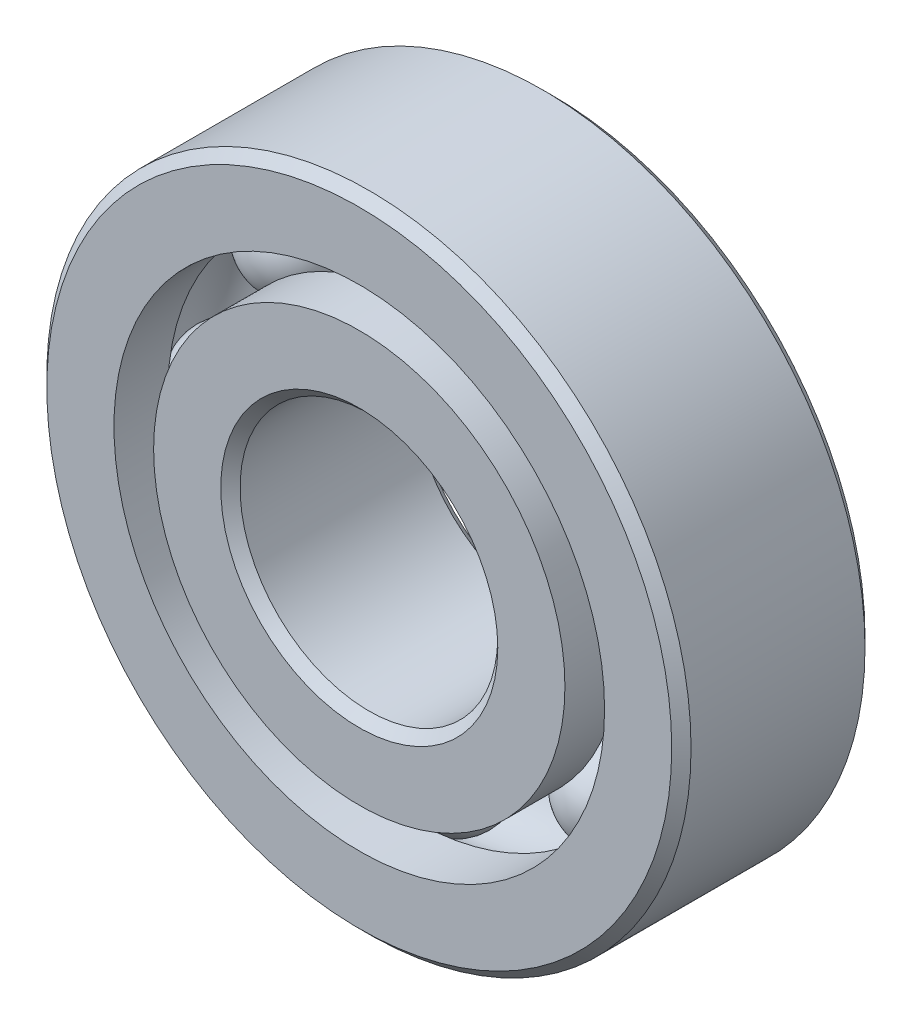
ISO-10303-21;
HEADER;
FILE_DESCRIPTION(('STEP AP214'),'2;1');
FILE_NAME('part.step','',(''),(''),'','','');
FILE_SCHEMA(('AUTOMOTIVE_DESIGN { 1 0 10303 214 1 1 1 1 }'));
ENDSEC;
DATA;
#1=APPLICATION_CONTEXT('core data for automotive mechanical design processes');
#2=APPLICATION_PROTOCOL_DEFINITION('international standard','automotive_design',2000,#1);
#3=PRODUCT_CONTEXT('',#1,'mechanical');
#4=PRODUCT('Part','Part','',(#3));
#5=PRODUCT_RELATED_PRODUCT_CATEGORY('part','',(#4));
#6=PRODUCT_DEFINITION_FORMATION('','',#4);
#7=PRODUCT_DEFINITION_CONTEXT('part definition',#1,'design');
#8=PRODUCT_DEFINITION('design','',#6,#7);
#9=PRODUCT_DEFINITION_SHAPE('','',#8);
#10=(LENGTH_UNIT() NAMED_UNIT(*) SI_UNIT(.MILLI.,.METRE.));
#11=(NAMED_UNIT(*) PLANE_ANGLE_UNIT() SI_UNIT($,.RADIAN.));
#12=(NAMED_UNIT(*) SI_UNIT($,.STERADIAN.) SOLID_ANGLE_UNIT());
#13=UNCERTAINTY_MEASURE_WITH_UNIT(LENGTH_MEASURE(1.E-05),#10,'distance_accuracy_value','');
#14=(GEOMETRIC_REPRESENTATION_CONTEXT(3) GLOBAL_UNCERTAINTY_ASSIGNED_CONTEXT((#13)) GLOBAL_UNIT_ASSIGNED_CONTEXT((#10,
#11,#12)) REPRESENTATION_CONTEXT('',''));
#15=CARTESIAN_POINT('',(0.,0.,0.));
#16=DIRECTION('',(0.,0.,1.));
#17=DIRECTION('',(1.,0.,0.));
#18=AXIS2_PLACEMENT_3D('',#15,#16,#17);
#19=CARTESIAN_POINT('',(-3.92886205296771,3.9288620529678,0.));
#20=DIRECTION('',(0.,0.,1.));
#21=DIRECTION('',(-0.707106781186539,0.707106781186556,0.));
#22=AXIS2_PLACEMENT_3D('',#19,#20,#21);
#23=SPHERICAL_SURFACE('',#22,1.1656174839975);
#24=CARTESIAN_POINT('',(-3.92886205296771,3.9288620529678,1.16561748399749));
#25=VERTEX_POINT('',#24);
#26=VERTEX_LOOP('',#25);
#27=FACE_BOUND('',#26,.T.);
#28=ADVANCED_FACE('F40',(#27),#23,.T.);
#29=CLOSED_SHELL('',(#28));
#30=MANIFOLD_SOLID_BREP('B2',#29);
#31=CARTESIAN_POINT('',(-5.55625,0.,0.));
#32=DIRECTION('',(0.,0.,1.));
#33=DIRECTION('',(-1.,0.,0.));
#34=AXIS2_PLACEMENT_3D('',#31,#32,#33);
#35=SPHERICAL_SURFACE('',#34,1.1656174839975);
#36=CARTESIAN_POINT('',(-5.55625,0.,1.16561748399749));
#37=VERTEX_POINT('',#36);
#38=VERTEX_LOOP('',#37);
#39=FACE_BOUND('',#38,.T.);
#40=ADVANCED_FACE('F61',(#39),#35,.T.);
#41=CLOSED_SHELL('',(#40));
#42=MANIFOLD_SOLID_BREP('B6',#41);
#43=CARTESIAN_POINT('',(-3.92886205296779,-3.92886205296772,0.));
#44=DIRECTION('',(0.,0.,1.));
#45=DIRECTION('',(-0.707106781186554,-0.707106781186541,0.));
#46=AXIS2_PLACEMENT_3D('',#43,#44,#45);
#47=SPHERICAL_SURFACE('',#46,1.1656174839975);
#48=CARTESIAN_POINT('',(-3.92886205296779,-3.92886205296772,1.16561748399749));
#49=VERTEX_POINT('',#48);
#50=VERTEX_LOOP('',#49);
#51=FACE_BOUND('',#50,.T.);
#52=ADVANCED_FACE('F82',(#51),#47,.T.);
#53=CLOSED_SHELL('',(#52));
#54=MANIFOLD_SOLID_BREP('B36',#53);
#55=CARTESIAN_POINT('',(0.,-5.55625,0.));
#56=DIRECTION('',(0.,0.,1.));
#57=DIRECTION('',(0.,-1.,0.));
#58=AXIS2_PLACEMENT_3D('',#55,#56,#57);
#59=SPHERICAL_SURFACE('',#58,1.1656174839975);
#60=CARTESIAN_POINT('',(0.,-5.55625,1.16561748399749));
#61=VERTEX_POINT('',#60);
#62=VERTEX_LOOP('',#61);
#63=FACE_BOUND('',#62,.T.);
#64=ADVANCED_FACE('F103',(#63),#59,.T.);
#65=CLOSED_SHELL('',(#64));
#66=MANIFOLD_SOLID_BREP('B57',#65);
#67=CARTESIAN_POINT('',(3.92886205296773,-3.92886205296777,0.));
#68=DIRECTION('',(0.,0.,1.));
#69=DIRECTION('',(0.707106781186544,-0.707106781186551,0.));
#70=AXIS2_PLACEMENT_3D('',#67,#68,#69);
#71=SPHERICAL_SURFACE('',#70,1.1656174839975);
#72=CARTESIAN_POINT('',(3.92886205296773,-3.92886205296777,1.16561748399749));
#73=VERTEX_POINT('',#72);
#74=VERTEX_LOOP('',#73);
#75=FACE_BOUND('',#74,.T.);
#76=ADVANCED_FACE('F124',(#75),#71,.T.);
#77=CLOSED_SHELL('',(#76));
#78=MANIFOLD_SOLID_BREP('B78',#77);
#79=CARTESIAN_POINT('',(5.55625,0.,0.));
#80=DIRECTION('',(0.,0.,1.));
#81=DIRECTION('',(1.,0.,0.));
#82=AXIS2_PLACEMENT_3D('',#79,#80,#81);
#83=SPHERICAL_SURFACE('',#82,1.1656174839975);
#84=CARTESIAN_POINT('',(5.55625,0.,1.16561748399749));
#85=VERTEX_POINT('',#84);
#86=VERTEX_LOOP('',#85);
#87=FACE_BOUND('',#86,.T.);
#88=ADVANCED_FACE('F145',(#87),#83,.T.);
#89=CLOSED_SHELL('',(#88));
#90=MANIFOLD_SOLID_BREP('B99',#89);
#91=CARTESIAN_POINT('',(3.92886205296776,3.92886205296775,0.));
#92=DIRECTION('',(0.,0.,1.));
#93=DIRECTION('',(0.707106781186549,0.707106781186546,0.));
#94=AXIS2_PLACEMENT_3D('',#91,#92,#93);
#95=SPHERICAL_SURFACE('',#94,1.1656174839975);
#96=CARTESIAN_POINT('',(3.92886205296776,3.92886205296775,1.16561748399749));
#97=VERTEX_POINT('',#96);
#98=VERTEX_LOOP('',#97);
#99=FACE_BOUND('',#98,.T.);
#100=ADVANCED_FACE('F166',(#99),#95,.T.);
#101=CLOSED_SHELL('',(#100));
#102=MANIFOLD_SOLID_BREP('B120',#101);
#103=CARTESIAN_POINT('',(0.,5.55625,0.));
#104=DIRECTION('',(0.,0.,1.));
#105=DIRECTION('',(0.,1.,0.));
#106=AXIS2_PLACEMENT_3D('',#103,#104,#105);
#107=SPHERICAL_SURFACE('',#106,1.1656174839975);
#108=CARTESIAN_POINT('',(0.,5.55625,1.16561748399749));
#109=VERTEX_POINT('',#108);
#110=VERTEX_LOOP('',#109);
#111=FACE_BOUND('',#110,.T.);
#112=ADVANCED_FACE('F189',(#111),#107,.T.);
#113=CLOSED_SHELL('',(#112));
#114=MANIFOLD_SOLID_BREP('B141',#113);
#115=CARTESIAN_POINT('',(0.,5.06778846153847,2.38125));
#116=DIRECTION('',(0.,0.,-1.));
#117=DIRECTION('',(-1.,0.,0.));
#118=AXIS2_PLACEMENT_3D('',#115,#116,#117);
#119=PLANE('',#118);
#120=CARTESIAN_POINT('',(0.,0.,2.38125));
#121=DIRECTION('',(0.,0.,1.));
#122=DIRECTION('',(1.,0.,0.));
#123=AXIS2_PLACEMENT_3D('',#120,#121,#122);
#124=CIRCLE('',#123,3.413125);
#125=CARTESIAN_POINT('',(3.413125,0.,2.38125));
#126=VERTEX_POINT('',#125);
#127=EDGE_CURVE('E237',#126,#126,#124,.T.);
#128=ORIENTED_EDGE('',*,*,#127,.F.);
#129=EDGE_LOOP('',(#128));
#130=FACE_BOUND('',#129,.T.);
#131=CARTESIAN_POINT('',(0.,0.,2.38125));
#132=DIRECTION('',(0.,0.,1.));
#133=DIRECTION('',(1.,0.,0.));
#134=AXIS2_PLACEMENT_3D('',#131,#132,#133);
#135=CIRCLE('',#134,5.06778846153847);
#136=CARTESIAN_POINT('',(5.06778846153847,0.,2.38125));
#137=VERTEX_POINT('',#136);
#138=EDGE_CURVE('E188',#137,#137,#135,.T.);
#139=ORIENTED_EDGE('',*,*,#138,.T.);
#140=EDGE_LOOP('',(#139));
#141=FACE_BOUND('',#140,.T.);
#142=ADVANCED_FACE('F209',(#130,#141),#119,.F.);
#143=CARTESIAN_POINT('',(0.,0.,2.38125));
#144=DIRECTION('',(0.,0.,1.));
#145=DIRECTION('',(1.,0.,0.));
#146=AXIS2_PLACEMENT_3D('',#143,#144,#145);
#147=CYLINDRICAL_SURFACE('',#146,5.06778846153847);
#148=ORIENTED_EDGE('',*,*,#138,.F.);
#149=EDGE_LOOP('',(#148));
#150=FACE_BOUND('',#149,.T.);
#151=CARTESIAN_POINT('',(0.,0.,1.05833333333333));
#152=DIRECTION('',(0.,0.,1.));
#153=DIRECTION('',(1.,0.,0.));
#154=AXIS2_PLACEMENT_3D('',#151,#152,#153);
#155=CIRCLE('',#154,5.06778846153847);
#156=CARTESIAN_POINT('',(5.06778846153847,0.,1.05833333333333));
#157=VERTEX_POINT('',#156);
#158=EDGE_CURVE('E215',#157,#157,#155,.T.);
#159=ORIENTED_EDGE('',*,*,#158,.T.);
#160=EDGE_LOOP('',(#159));
#161=FACE_BOUND('',#160,.T.);
#162=ADVANCED_FACE('F244',(#150,#161),#147,.T.);
#163=CARTESIAN_POINT('',(0.,0.,0.));
#164=DIRECTION('',(0.,0.,1.));
#165=DIRECTION('',(1.,0.,0.));
#166=AXIS2_PLACEMENT_3D('',#163,#164,#165);
#167=TOROIDAL_SURFACE('',#166,5.55625,1.16561748399749);
#168=ORIENTED_EDGE('',*,*,#158,.F.);
#169=EDGE_LOOP('',(#168));
#170=FACE_BOUND('',#169,.T.);
#171=CARTESIAN_POINT('',(0.,0.,-1.05833333333333));
#172=DIRECTION('',(0.,0.,1.));
#173=DIRECTION('',(1.,0.,0.));
#174=AXIS2_PLACEMENT_3D('',#171,#172,#173);
#175=CIRCLE('',#174,5.06778846153847);
#176=CARTESIAN_POINT('',(5.06778846153847,0.,-1.05833333333333));
#177=VERTEX_POINT('',#176);
#178=EDGE_CURVE('E219',#177,#177,#175,.T.);
#179=ORIENTED_EDGE('',*,*,#178,.T.);
#180=EDGE_LOOP('',(#179));
#181=FACE_BOUND('',#180,.T.);
#182=ADVANCED_FACE('F248',(#170,#181),#167,.F.);
#183=CARTESIAN_POINT('',(0.,0.,2.38125));
#184=DIRECTION('',(0.,0.,1.));
#185=DIRECTION('',(1.,0.,0.));
#186=AXIS2_PLACEMENT_3D('',#183,#184,#185);
#187=CYLINDRICAL_SURFACE('',#186,5.06778846153847);
#188=ORIENTED_EDGE('',*,*,#178,.F.);
#189=EDGE_LOOP('',(#188));
#190=FACE_BOUND('',#189,.T.);
#191=CARTESIAN_POINT('',(0.,0.,-2.38125));
#192=DIRECTION('',(0.,0.,1.));
#193=DIRECTION('',(1.,0.,0.));
#194=AXIS2_PLACEMENT_3D('',#191,#192,#193);
#195=CIRCLE('',#194,5.06778846153847);
#196=CARTESIAN_POINT('',(5.06778846153847,0.,-2.38125));
#197=VERTEX_POINT('',#196);
#198=EDGE_CURVE('E223',#197,#197,#195,.T.);
#199=ORIENTED_EDGE('',*,*,#198,.T.);
#200=EDGE_LOOP('',(#199));
#201=FACE_BOUND('',#200,.T.);
#202=ADVANCED_FACE('F253',(#190,#201),#187,.T.);
#203=CARTESIAN_POINT('',(0.,3.413125,-2.38125000000001));
#204=DIRECTION('',(0.,0.,1.));
#205=DIRECTION('',(1.,0.,0.));
#206=AXIS2_PLACEMENT_3D('',#203,#204,#205);
#207=PLANE('',#206);
#208=ORIENTED_EDGE('',*,*,#198,.F.);
#209=EDGE_LOOP('',(#208));
#210=FACE_BOUND('',#209,.T.);
#211=CARTESIAN_POINT('',(0.,0.,-2.38125000000001));
#212=DIRECTION('',(0.,0.,1.));
#213=DIRECTION('',(1.,0.,0.));
#214=AXIS2_PLACEMENT_3D('',#211,#212,#213);
#215=CIRCLE('',#214,3.413125);
#216=CARTESIAN_POINT('',(3.413125,0.,-2.38125000000001));
#217=VERTEX_POINT('',#216);
#218=EDGE_CURVE('E228',#217,#217,#215,.T.);
#219=ORIENTED_EDGE('',*,*,#218,.T.);
#220=EDGE_LOOP('',(#219));
#221=FACE_BOUND('',#220,.T.);
#222=ADVANCED_FACE('F259',(#210,#221),#207,.F.);
#223=CARTESIAN_POINT('',(0.,0.,-2.14312500000001));
#224=DIRECTION('',(0.,0.,-1.));
#225=DIRECTION('',(-1.,0.,0.));
#226=AXIS2_PLACEMENT_3D('',#223,#224,#225);
#227=CONICAL_SURFACE('',#226,3.175,0.785398163397448);
#228=ORIENTED_EDGE('',*,*,#218,.F.);
#229=EDGE_LOOP('',(#228));
#230=FACE_BOUND('',#229,.T.);
#231=CARTESIAN_POINT('',(0.,0.,-2.14312500000001));
#232=DIRECTION('',(0.,0.,1.));
#233=DIRECTION('',(1.,0.,0.));
#234=AXIS2_PLACEMENT_3D('',#231,#232,#233);
#235=CIRCLE('',#234,3.175);
#236=CARTESIAN_POINT('',(3.175,0.,-2.14312500000001));
#237=VERTEX_POINT('',#236);
#238=EDGE_CURVE('E231',#237,#237,#235,.T.);
#239=ORIENTED_EDGE('',*,*,#238,.T.);
#240=EDGE_LOOP('',(#239));
#241=FACE_BOUND('',#240,.T.);
#242=ADVANCED_FACE('F263',(#230,#241),#227,.F.);
#243=CARTESIAN_POINT('',(0.,0.,2.38125));
#244=DIRECTION('',(0.,0.,1.));
#245=DIRECTION('',(1.,0.,0.));
#246=AXIS2_PLACEMENT_3D('',#243,#244,#245);
#247=CYLINDRICAL_SURFACE('',#246,3.175);
#248=ORIENTED_EDGE('',*,*,#238,.F.);
#249=EDGE_LOOP('',(#248));
#250=FACE_BOUND('',#249,.T.);
#251=CARTESIAN_POINT('',(0.,0.,2.143125));
#252=DIRECTION('',(0.,0.,1.));
#253=DIRECTION('',(1.,0.,0.));
#254=AXIS2_PLACEMENT_3D('',#251,#252,#253);
#255=CIRCLE('',#254,3.175);
#256=CARTESIAN_POINT('',(3.175,0.,2.143125));
#257=VERTEX_POINT('',#256);
#258=EDGE_CURVE('E234',#257,#257,#255,.T.);
#259=ORIENTED_EDGE('',*,*,#258,.T.);
#260=EDGE_LOOP('',(#259));
#261=FACE_BOUND('',#260,.T.);
#262=ADVANCED_FACE('F267',(#250,#261),#247,.F.);
#263=CARTESIAN_POINT('',(0.,0.,2.38125));
#264=DIRECTION('',(0.,0.,1.));
#265=DIRECTION('',(1.,0.,0.));
#266=AXIS2_PLACEMENT_3D('',#263,#264,#265);
#267=CONICAL_SURFACE('',#266,3.413125,0.785398163397448);
#268=ORIENTED_EDGE('',*,*,#258,.F.);
#269=EDGE_LOOP('',(#268));
#270=FACE_BOUND('',#269,.T.);
#271=ORIENTED_EDGE('',*,*,#127,.T.);
#272=EDGE_LOOP('',(#271));
#273=FACE_BOUND('',#272,.T.);
#274=ADVANCED_FACE('F241',(#270,#273),#267,.F.);
#275=CLOSED_SHELL('',(#142,#162,#182,#202,#222,#242,#262,#274));
#276=MANIFOLD_SOLID_BREP('B162',#275);
#277=CARTESIAN_POINT('',(0.,0.,2.143125));
#278=DIRECTION('',(0.,0.,-1.));
#279=DIRECTION('',(-1.,0.,0.));
#280=AXIS2_PLACEMENT_3D('',#277,#278,#279);
#281=CONICAL_SURFACE('',#280,7.9375,0.785398163397448);
#282=CARTESIAN_POINT('',(0.,0.,2.38125));
#283=DIRECTION('',(0.,0.,1.));
#284=DIRECTION('',(1.,0.,0.));
#285=AXIS2_PLACEMENT_3D('',#282,#283,#284);
#286=CIRCLE('',#285,7.699375);
#287=CARTESIAN_POINT('',(7.699375,0.,2.38125));
#288=VERTEX_POINT('',#287);
#289=EDGE_CURVE('E359',#288,#288,#286,.T.);
#290=ORIENTED_EDGE('',*,*,#289,.F.);
#291=EDGE_LOOP('',(#290));
#292=FACE_BOUND('',#291,.T.);
#293=CARTESIAN_POINT('',(0.,0.,2.143125));
#294=DIRECTION('',(0.,0.,1.));
#295=DIRECTION('',(1.,0.,0.));
#296=AXIS2_PLACEMENT_3D('',#293,#294,#295);
#297=CIRCLE('',#296,7.9375);
#298=CARTESIAN_POINT('',(7.9375,0.,2.143125));
#299=VERTEX_POINT('',#298);
#300=EDGE_CURVE('E208',#299,#299,#297,.T.);
#301=ORIENTED_EDGE('',*,*,#300,.T.);
#302=EDGE_LOOP('',(#301));
#303=FACE_BOUND('',#302,.T.);
#304=ADVANCED_FACE('F331',(#292,#303),#281,.T.);
#305=CARTESIAN_POINT('',(0.,0.,2.38125));
#306=DIRECTION('',(0.,0.,1.));
#307=DIRECTION('',(1.,0.,0.));
#308=AXIS2_PLACEMENT_3D('',#305,#306,#307);
#309=CYLINDRICAL_SURFACE('',#308,7.9375);
#310=ORIENTED_EDGE('',*,*,#300,.F.);
#311=EDGE_LOOP('',(#310));
#312=FACE_BOUND('',#311,.T.);
#313=CARTESIAN_POINT('',(0.,0.,-2.14312500000001));
#314=DIRECTION('',(0.,0.,1.));
#315=DIRECTION('',(1.,0.,0.));
#316=AXIS2_PLACEMENT_3D('',#313,#314,#315);
#317=CIRCLE('',#316,7.9375);
#318=CARTESIAN_POINT('',(7.9375,0.,-2.14312500000001));
#319=VERTEX_POINT('',#318);
#320=EDGE_CURVE('E337',#319,#319,#317,.T.);
#321=ORIENTED_EDGE('',*,*,#320,.T.);
#322=EDGE_LOOP('',(#321));
#323=FACE_BOUND('',#322,.T.);
#324=ADVANCED_FACE('F366',(#312,#323),#309,.T.);
#325=CARTESIAN_POINT('',(0.,0.,-2.38125000000001));
#326=DIRECTION('',(0.,0.,1.));
#327=DIRECTION('',(1.,0.,0.));
#328=AXIS2_PLACEMENT_3D('',#325,#326,#327);
#329=CONICAL_SURFACE('',#328,7.699375,0.785398163397448);
#330=ORIENTED_EDGE('',*,*,#320,.F.);
#331=EDGE_LOOP('',(#330));
#332=FACE_BOUND('',#331,.T.);
#333=CARTESIAN_POINT('',(0.,0.,-2.38125000000001));
#334=DIRECTION('',(0.,0.,1.));
#335=DIRECTION('',(1.,0.,0.));
#336=AXIS2_PLACEMENT_3D('',#333,#334,#335);
#337=CIRCLE('',#336,7.699375);
#338=CARTESIAN_POINT('',(7.699375,0.,-2.38125000000001));
#339=VERTEX_POINT('',#338);
#340=EDGE_CURVE('E341',#339,#339,#337,.T.);
#341=ORIENTED_EDGE('',*,*,#340,.T.);
#342=EDGE_LOOP('',(#341));
#343=FACE_BOUND('',#342,.T.);
#344=ADVANCED_FACE('F370',(#332,#343),#329,.T.);
#345=CARTESIAN_POINT('',(0.,7.699375,-2.38125000000001));
#346=DIRECTION('',(0.,0.,1.));
#347=DIRECTION('',(1.,0.,0.));
#348=AXIS2_PLACEMENT_3D('',#345,#346,#347);
#349=PLANE('',#348);
#350=ORIENTED_EDGE('',*,*,#340,.F.);
#351=EDGE_LOOP('',(#350));
#352=FACE_BOUND('',#351,.T.);
#353=CARTESIAN_POINT('',(0.,0.,-2.38125000000001));
#354=DIRECTION('',(0.,0.,1.));
#355=DIRECTION('',(1.,0.,0.));
#356=AXIS2_PLACEMENT_3D('',#353,#354,#355);
#357=CIRCLE('',#356,6.04471153846153);
#358=CARTESIAN_POINT('',(6.04471153846153,0.,-2.38125000000001));
#359=VERTEX_POINT('',#358);
#360=EDGE_CURVE('E345',#359,#359,#357,.T.);
#361=ORIENTED_EDGE('',*,*,#360,.T.);
#362=EDGE_LOOP('',(#361));
#363=FACE_BOUND('',#362,.T.);
#364=ADVANCED_FACE('F375',(#352,#363),#349,.F.);
#365=CARTESIAN_POINT('',(0.,0.,2.38125));
#366=DIRECTION('',(0.,0.,1.));
#367=DIRECTION('',(1.,0.,0.));
#368=AXIS2_PLACEMENT_3D('',#365,#366,#367);
#369=CYLINDRICAL_SURFACE('',#368,6.04471153846153);
#370=ORIENTED_EDGE('',*,*,#360,.F.);
#371=EDGE_LOOP('',(#370));
#372=FACE_BOUND('',#371,.T.);
#373=CARTESIAN_POINT('',(0.,0.,-1.05833333333334));
#374=DIRECTION('',(0.,0.,1.));
#375=DIRECTION('',(1.,0.,0.));
#376=AXIS2_PLACEMENT_3D('',#373,#374,#375);
#377=CIRCLE('',#376,6.04471153846153);
#378=CARTESIAN_POINT('',(6.04471153846153,0.,-1.05833333333334));
#379=VERTEX_POINT('',#378);
#380=EDGE_CURVE('E350',#379,#379,#377,.T.);
#381=ORIENTED_EDGE('',*,*,#380,.T.);
#382=EDGE_LOOP('',(#381));
#383=FACE_BOUND('',#382,.T.);
#384=ADVANCED_FACE('F381',(#372,#383),#369,.F.);
#385=CARTESIAN_POINT('',(0.,0.,0.));
#386=DIRECTION('',(0.,0.,1.));
#387=DIRECTION('',(1.,0.,0.));
#388=AXIS2_PLACEMENT_3D('',#385,#386,#387);
#389=TOROIDAL_SURFACE('',#388,5.55625,1.1656174839975);
#390=ORIENTED_EDGE('',*,*,#380,.F.);
#391=EDGE_LOOP('',(#390));
#392=FACE_BOUND('',#391,.T.);
#393=CARTESIAN_POINT('',(0.,0.,1.05833333333333));
#394=DIRECTION('',(0.,0.,1.));
#395=DIRECTION('',(1.,0.,0.));
#396=AXIS2_PLACEMENT_3D('',#393,#394,#395);
#397=CIRCLE('',#396,6.04471153846153);
#398=CARTESIAN_POINT('',(6.04471153846153,0.,1.05833333333333));
#399=VERTEX_POINT('',#398);
#400=EDGE_CURVE('E353',#399,#399,#397,.T.);
#401=ORIENTED_EDGE('',*,*,#400,.T.);
#402=EDGE_LOOP('',(#401));
#403=FACE_BOUND('',#402,.T.);
#404=ADVANCED_FACE('F385',(#392,#403),#389,.F.);
#405=CARTESIAN_POINT('',(0.,0.,2.38125));
#406=DIRECTION('',(0.,0.,1.));
#407=DIRECTION('',(1.,0.,0.));
#408=AXIS2_PLACEMENT_3D('',#405,#406,#407);
#409=CYLINDRICAL_SURFACE('',#408,6.04471153846153);
#410=ORIENTED_EDGE('',*,*,#400,.F.);
#411=EDGE_LOOP('',(#410));
#412=FACE_BOUND('',#411,.T.);
#413=CARTESIAN_POINT('',(0.,0.,2.38125));
#414=DIRECTION('',(0.,0.,1.));
#415=DIRECTION('',(1.,0.,0.));
#416=AXIS2_PLACEMENT_3D('',#413,#414,#415);
#417=CIRCLE('',#416,6.04471153846153);
#418=CARTESIAN_POINT('',(6.04471153846153,0.,2.38125));
#419=VERTEX_POINT('',#418);
#420=EDGE_CURVE('E356',#419,#419,#417,.T.);
#421=ORIENTED_EDGE('',*,*,#420,.T.);
#422=EDGE_LOOP('',(#421));
#423=FACE_BOUND('',#422,.T.);
#424=ADVANCED_FACE('F389',(#412,#423),#409,.F.);
#425=CARTESIAN_POINT('',(0.,7.699375,2.38125));
#426=DIRECTION('',(0.,0.,-1.));
#427=DIRECTION('',(-1.,0.,0.));
#428=AXIS2_PLACEMENT_3D('',#425,#426,#427);
#429=PLANE('',#428);
#430=ORIENTED_EDGE('',*,*,#420,.F.);
#431=EDGE_LOOP('',(#430));
#432=FACE_BOUND('',#431,.T.);
#433=ORIENTED_EDGE('',*,*,#289,.T.);
#434=EDGE_LOOP('',(#433));
#435=FACE_BOUND('',#434,.T.);
#436=ADVANCED_FACE('F363',(#432,#435),#429,.F.);
#437=CLOSED_SHELL('',(#304,#324,#344,#364,#384,#404,#424,#436));
#438=MANIFOLD_SOLID_BREP('B183',#437);
#439=ADVANCED_BREP_SHAPE_REPRESENTATION('',(#18,#30,#42,#54,#66,#78,#90,#102,#114,#276,#438),#14);
#440=SHAPE_DEFINITION_REPRESENTATION(#9,#439);
ENDSEC;
END-ISO-10303-21;
